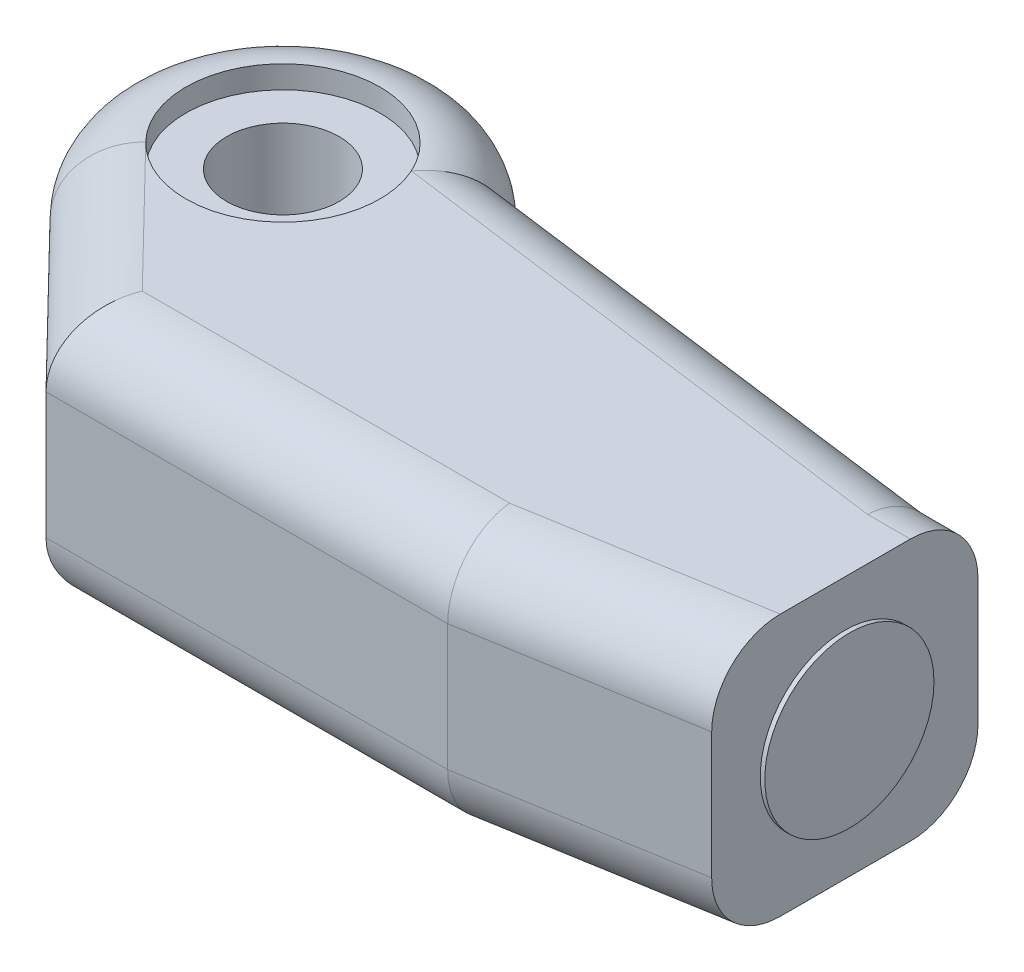
ISO-10303-21;
HEADER;
FILE_DESCRIPTION(('STEP AP214'),'2;1');
FILE_NAME('part.step','',(''),(''),'','','');
FILE_SCHEMA(('AUTOMOTIVE_DESIGN { 1 0 10303 214 1 1 1 1 }'));
ENDSEC;
DATA;
#1=APPLICATION_CONTEXT('core data for automotive mechanical design processes');
#2=APPLICATION_PROTOCOL_DEFINITION('international standard','automotive_design',2000,#1);
#3=PRODUCT_CONTEXT('',#1,'mechanical');
#4=PRODUCT('Part','Part','',(#3));
#5=PRODUCT_RELATED_PRODUCT_CATEGORY('part','',(#4));
#6=PRODUCT_DEFINITION_FORMATION('','',#4);
#7=PRODUCT_DEFINITION_CONTEXT('part definition',#1,'design');
#8=PRODUCT_DEFINITION('design','',#6,#7);
#9=PRODUCT_DEFINITION_SHAPE('','',#8);
#10=(LENGTH_UNIT() NAMED_UNIT(*) SI_UNIT(.MILLI.,.METRE.));
#11=(NAMED_UNIT(*) PLANE_ANGLE_UNIT() SI_UNIT($,.RADIAN.));
#12=(NAMED_UNIT(*) SI_UNIT($,.STERADIAN.) SOLID_ANGLE_UNIT());
#13=UNCERTAINTY_MEASURE_WITH_UNIT(LENGTH_MEASURE(1.E-05),#10,'distance_accuracy_value','');
#14=(GEOMETRIC_REPRESENTATION_CONTEXT(3) GLOBAL_UNCERTAINTY_ASSIGNED_CONTEXT((#13)) GLOBAL_UNIT_ASSIGNED_CONTEXT((#10,
#11,#12)) REPRESENTATION_CONTEXT('',''));
#15=CARTESIAN_POINT('',(0.,0.,0.));
#16=DIRECTION('',(0.,0.,1.));
#17=DIRECTION('',(1.,0.,0.));
#18=AXIS2_PLACEMENT_3D('',#15,#16,#17);
#19=CARTESIAN_POINT('',(0.,58.,0.));
#20=DIRECTION('',(0.,-1.,0.));
#21=DIRECTION('',(0.,0.,-1.));
#22=AXIS2_PLACEMENT_3D('',#19,#20,#21);
#23=CYLINDRICAL_SURFACE('',#22,73.);
#24=DIRECTION('',(0.,-1.,0.));
#25=VECTOR('',#24,1.);
#26=CARTESIAN_POINT('',(-52.3049225386602,58.,50.9234236695134));
#27=LINE('',#26,#25);
#28=CARTESIAN_POINT('',(-52.3049225386602,28.,50.9234236695134));
#29=VERTEX_POINT('',#28);
#30=CARTESIAN_POINT('',(-52.3049225386602,-28.,50.9234236695134));
#31=VERTEX_POINT('',#30);
#32=EDGE_CURVE('E310',#29,#31,#27,.T.);
#33=ORIENTED_EDGE('',*,*,#32,.F.);
#34=CARTESIAN_POINT('',(0.,28.,0.));
#35=DIRECTION('',(0.,1.,0.));
#36=DIRECTION('',(0.,0.,1.));
#37=AXIS2_PLACEMENT_3D('',#34,#35,#36);
#38=CIRCLE('',#37,73.);
#39=CARTESIAN_POINT('',(57.,28.,-45.6070170039656));
#40=VERTEX_POINT('',#39);
#41=EDGE_CURVE('E341',#29,#40,#38,.F.);
#42=ORIENTED_EDGE('',*,*,#41,.T.);
#43=DIRECTION('',(0.,-1.,0.));
#44=VECTOR('',#43,1.);
#45=CARTESIAN_POINT('',(57.,58.,-45.6070170039656));
#46=LINE('',#45,#44);
#47=CARTESIAN_POINT('',(57.,-28.,-45.6070170039656));
#48=VERTEX_POINT('',#47);
#49=EDGE_CURVE('E301',#40,#48,#46,.T.);
#50=ORIENTED_EDGE('',*,*,#49,.T.);
#51=CARTESIAN_POINT('',(0.,-28.,0.));
#52=DIRECTION('',(0.,1.,0.));
#53=DIRECTION('',(0.,0.,1.));
#54=AXIS2_PLACEMENT_3D('',#51,#52,#53);
#55=CIRCLE('',#54,73.);
#56=EDGE_CURVE('E161',#48,#31,#55,.T.);
#57=ORIENTED_EDGE('',*,*,#56,.T.);
#58=EDGE_LOOP('',(#33,#42,#50,#57));
#59=FACE_BOUND('',#58,.T.);
#60=ADVANCED_FACE('F38',(#59),#23,.T.);
#61=CARTESIAN_POINT('',(-52.3049225386602,58.,50.9234236695134));
#62=DIRECTION('',(0.716505788200824,0.,-0.697581146157718));
#63=DIRECTION('',(-0.697581146157718,0.,-0.716505788200824));
#64=AXIS2_PLACEMENT_3D('',#61,#62,#63);
#65=PLANE('',#64);
#66=DIRECTION('',(0.,-1.,0.));
#67=VECTOR('',#66,1.);
#68=CARTESIAN_POINT('',(13.,58.,118.));
#69=LINE('',#68,#67);
#70=CARTESIAN_POINT('',(13.,28.,118.));
#71=VERTEX_POINT('',#70);
#72=CARTESIAN_POINT('',(13.,-28.,118.));
#73=VERTEX_POINT('',#72);
#74=EDGE_CURVE('E307',#71,#73,#69,.T.);
#75=ORIENTED_EDGE('',*,*,#74,.F.);
#76=DIRECTION('',(0.697581146157718,0.,0.716505788200824));
#77=VECTOR('',#76,1.);
#78=CARTESIAN_POINT('',(-52.3049225386602,28.,50.9234236695134));
#79=LINE('',#78,#77);
#80=EDGE_CURVE('E334',#71,#29,#79,.F.);
#81=ORIENTED_EDGE('',*,*,#80,.T.);
#82=ORIENTED_EDGE('',*,*,#32,.T.);
#83=DIRECTION('',(0.697581146157718,0.,0.716505788200824));
#84=VECTOR('',#83,1.);
#85=CARTESIAN_POINT('',(-52.3049225386602,-28.,50.9234236695134));
#86=LINE('',#85,#84);
#87=EDGE_CURVE('E332',#31,#73,#86,.T.);
#88=ORIENTED_EDGE('',*,*,#87,.T.);
#89=EDGE_LOOP('',(#75,#81,#82,#88));
#90=FACE_BOUND('',#89,.T.);
#91=ADVANCED_FACE('F214',(#90),#65,.F.);
#92=CARTESIAN_POINT('',(191.,58.,118.));
#93=DIRECTION('',(0.,0.,-1.));
#94=DIRECTION('',(-1.,0.,0.));
#95=AXIS2_PLACEMENT_3D('',#92,#93,#94);
#96=PLANE('',#95);
#97=DIRECTION('',(0.,-1.,0.));
#98=VECTOR('',#97,1.);
#99=CARTESIAN_POINT('',(191.,58.,118.));
#100=LINE('',#99,#98);
#101=CARTESIAN_POINT('',(191.,28.,118.));
#102=VERTEX_POINT('',#101);
#103=CARTESIAN_POINT('',(191.,-28.,118.));
#104=VERTEX_POINT('',#103);
#105=EDGE_CURVE('E298',#102,#104,#100,.T.);
#106=ORIENTED_EDGE('',*,*,#105,.F.);
#107=DIRECTION('',(1.,0.,0.));
#108=VECTOR('',#107,1.);
#109=CARTESIAN_POINT('',(13.,28.,118.));
#110=LINE('',#109,#108);
#111=EDGE_CURVE('E330',#102,#71,#110,.F.);
#112=ORIENTED_EDGE('',*,*,#111,.T.);
#113=ORIENTED_EDGE('',*,*,#74,.T.);
#114=DIRECTION('',(1.,0.,0.));
#115=VECTOR('',#114,1.);
#116=CARTESIAN_POINT('',(191.,-28.,118.));
#117=LINE('',#116,#115);
#118=EDGE_CURVE('E328',#73,#104,#117,.T.);
#119=ORIENTED_EDGE('',*,*,#118,.T.);
#120=EDGE_LOOP('',(#106,#112,#113,#119));
#121=FACE_BOUND('',#120,.T.);
#122=ADVANCED_FACE('F220',(#121),#96,.F.);
#123=CARTESIAN_POINT('',(291.,58.,101.));
#124=DIRECTION('',(-0.167595493933869,0.,-0.985855846669818));
#125=DIRECTION('',(-0.985855846669818,0.,0.167595493933869));
#126=AXIS2_PLACEMENT_3D('',#123,#124,#125);
#127=PLANE('',#126);
#128=DIRECTION('',(0.,-1.,0.));
#129=VECTOR('',#128,1.);
#130=CARTESIAN_POINT('',(291.,58.,101.));
#131=LINE('',#130,#129);
#132=CARTESIAN_POINT('',(291.,28.,101.));
#133=VERTEX_POINT('',#132);
#134=CARTESIAN_POINT('',(291.,-28.,101.));
#135=VERTEX_POINT('',#134);
#136=EDGE_CURVE('E294',#133,#135,#131,.T.);
#137=ORIENTED_EDGE('',*,*,#136,.F.);
#138=DIRECTION('',(0.985855846669818,0.,-0.167595493933869));
#139=VECTOR('',#138,1.);
#140=CARTESIAN_POINT('',(191.,28.,118.));
#141=LINE('',#140,#139);
#142=EDGE_CURVE('E326',#133,#102,#141,.F.);
#143=ORIENTED_EDGE('',*,*,#142,.T.);
#144=ORIENTED_EDGE('',*,*,#105,.T.);
#145=DIRECTION('',(0.985855846669818,0.,-0.167595493933869));
#146=VECTOR('',#145,1.);
#147=CARTESIAN_POINT('',(291.,-28.,101.));
#148=LINE('',#147,#146);
#149=EDGE_CURVE('E324',#104,#135,#148,.T.);
#150=ORIENTED_EDGE('',*,*,#149,.T.);
#151=EDGE_LOOP('',(#137,#143,#144,#150));
#152=FACE_BOUND('',#151,.T.);
#153=ADVANCED_FACE('F382',(#152),#127,.F.);
#154=CARTESIAN_POINT('',(291.,58.,0.));
#155=DIRECTION('',(-1.,0.,0.));
#156=DIRECTION('',(0.,0.,1.));
#157=AXIS2_PLACEMENT_3D('',#154,#155,#156);
#158=PLANE('',#157);
#159=CARTESIAN_POINT('',(291.,0.,42.));
#160=DIRECTION('',(1.,0.,0.));
#161=DIRECTION('',(0.,0.,-1.));
#162=AXIS2_PLACEMENT_3D('',#159,#160,#161);
#163=CIRCLE('',#162,37.5);
#164=CARTESIAN_POINT('',(291.,0.,4.50000000000001));
#165=VERTEX_POINT('',#164);
#166=EDGE_CURVE('E313',#165,#165,#163,.T.);
#167=ORIENTED_EDGE('',*,*,#166,.F.);
#168=EDGE_LOOP('',(#167));
#169=FACE_BOUND('',#168,.T.);
#170=DIRECTION('',(0.,-1.,0.));
#171=VECTOR('',#170,1.);
#172=CARTESIAN_POINT('',(291.,58.,-17.));
#173=LINE('',#172,#171);
#174=CARTESIAN_POINT('',(291.,28.,-17.));
#175=VERTEX_POINT('',#174);
#176=CARTESIAN_POINT('',(291.,-28.,-17.));
#177=VERTEX_POINT('',#176);
#178=EDGE_CURVE('E290',#175,#177,#173,.T.);
#179=ORIENTED_EDGE('',*,*,#178,.F.);
#180=CARTESIAN_POINT('',(291.,28.,13.));
#181=DIRECTION('',(-1.,0.,0.));
#182=DIRECTION('',(0.,0.,1.));
#183=AXIS2_PLACEMENT_3D('',#180,#181,#182);
#184=CIRCLE('',#183,30.);
#185=CARTESIAN_POINT('',(291.,58.,13.));
#186=VERTEX_POINT('',#185);
#187=EDGE_CURVE('E284',#175,#186,#184,.F.);
#188=ORIENTED_EDGE('',*,*,#187,.T.);
#189=DIRECTION('',(0.,0.,-1.));
#190=VECTOR('',#189,1.);
#191=CARTESIAN_POINT('',(291.,58.,0.));
#192=LINE('',#191,#190);
#193=CARTESIAN_POINT('',(291.,58.,70.5695875808427));
#194=VERTEX_POINT('',#193);
#195=EDGE_CURVE('E273',#194,#186,#192,.T.);
#196=ORIENTED_EDGE('',*,*,#195,.F.);
#197=CARTESIAN_POINT('',(291.,28.,70.5695875808428));
#198=DIRECTION('',(-1.,0.,0.));
#199=DIRECTION('',(0.,0.,1.));
#200=AXIS2_PLACEMENT_3D('',#197,#198,#199);
#201=ELLIPSE('',#200,30.4304124191572,30.);
#202=EDGE_CURVE('E322',#194,#133,#201,.F.);
#203=ORIENTED_EDGE('',*,*,#202,.T.);
#204=ORIENTED_EDGE('',*,*,#136,.T.);
#205=CARTESIAN_POINT('',(291.,-28.,70.5695875808428));
#206=DIRECTION('',(-1.,0.,0.));
#207=DIRECTION('',(0.,0.,-1.));
#208=AXIS2_PLACEMENT_3D('',#205,#206,#207);
#209=ELLIPSE('',#208,30.4304124191572,30.);
#210=CARTESIAN_POINT('',(291.,-58.,70.5695875808428));
#211=VERTEX_POINT('',#210);
#212=EDGE_CURVE('E320',#135,#211,#209,.F.);
#213=ORIENTED_EDGE('',*,*,#212,.T.);
#214=DIRECTION('',(0.,0.,-1.));
#215=VECTOR('',#214,1.);
#216=CARTESIAN_POINT('',(291.,-58.,0.));
#217=LINE('',#216,#215);
#218=CARTESIAN_POINT('',(291.,-58.,13.));
#219=VERTEX_POINT('',#218);
#220=EDGE_CURVE('E361',#211,#219,#217,.T.);
#221=ORIENTED_EDGE('',*,*,#220,.T.);
#222=CARTESIAN_POINT('',(291.,-28.,13.));
#223=DIRECTION('',(-1.,0.,0.));
#224=DIRECTION('',(0.,0.,1.));
#225=AXIS2_PLACEMENT_3D('',#222,#223,#224);
#226=CIRCLE('',#225,30.);
#227=EDGE_CURVE('E282',#219,#177,#226,.F.);
#228=ORIENTED_EDGE('',*,*,#227,.T.);
#229=EDGE_LOOP('',(#179,#188,#196,#203,#204,#213,#221,#228));
#230=FACE_BOUND('',#229,.T.);
#231=ADVANCED_FACE('F288',(#169,#230),#158,.F.);
#232=CARTESIAN_POINT('',(291.,58.,-17.));
#233=DIRECTION('',(0.,0.,1.));
#234=DIRECTION('',(1.,0.,0.));
#235=AXIS2_PLACEMENT_3D('',#232,#233,#234);
#236=PLANE('',#235);
#237=DIRECTION('',(0.,-1.,0.));
#238=VECTOR('',#237,1.);
#239=CARTESIAN_POINT('',(274.,58.,-17.));
#240=LINE('',#239,#238);
#241=CARTESIAN_POINT('',(274.,28.,-17.));
#242=VERTEX_POINT('',#241);
#243=CARTESIAN_POINT('',(274.,-28.,-17.));
#244=VERTEX_POINT('',#243);
#245=EDGE_CURVE('E295',#242,#244,#240,.T.);
#246=ORIENTED_EDGE('',*,*,#245,.F.);
#247=DIRECTION('',(-1.,0.,0.));
#248=VECTOR('',#247,1.);
#249=CARTESIAN_POINT('',(291.,28.,-17.));
#250=LINE('',#249,#248);
#251=EDGE_CURVE('E267',#242,#175,#250,.F.);
#252=ORIENTED_EDGE('',*,*,#251,.T.);
#253=ORIENTED_EDGE('',*,*,#178,.T.);
#254=DIRECTION('',(-1.,0.,0.));
#255=VECTOR('',#254,1.);
#256=CARTESIAN_POINT('',(291.,-28.,-17.));
#257=LINE('',#256,#255);
#258=EDGE_CURVE('E274',#177,#244,#257,.T.);
#259=ORIENTED_EDGE('',*,*,#258,.T.);
#260=EDGE_LOOP('',(#246,#252,#253,#259));
#261=FACE_BOUND('',#260,.T.);
#262=ADVANCED_FACE('F374',(#261),#236,.F.);
#263=CARTESIAN_POINT('',(274.,58.,-17.));
#264=DIRECTION('',(-0.130698754240664,0.,0.991422127874872));
#265=DIRECTION('',(0.991422127874872,0.,0.130698754240664));
#266=AXIS2_PLACEMENT_3D('',#263,#264,#265);
#267=PLANE('',#266);
#268=ORIENTED_EDGE('',*,*,#49,.F.);
#269=DIRECTION('',(-0.991422127874872,0.,-0.130698754240664));
#270=VECTOR('',#269,1.);
#271=CARTESIAN_POINT('',(274.,28.,-17.));
#272=LINE('',#271,#270);
#273=EDGE_CURVE('E338',#40,#242,#272,.F.);
#274=ORIENTED_EDGE('',*,*,#273,.T.);
#275=ORIENTED_EDGE('',*,*,#245,.T.);
#276=DIRECTION('',(-0.991422127874872,0.,-0.130698754240664));
#277=VECTOR('',#276,1.);
#278=CARTESIAN_POINT('',(274.,-28.,-17.));
#279=LINE('',#278,#277);
#280=EDGE_CURVE('E336',#244,#48,#279,.T.);
#281=ORIENTED_EDGE('',*,*,#280,.T.);
#282=EDGE_LOOP('',(#268,#274,#275,#281));
#283=FACE_BOUND('',#282,.T.);
#284=ADVANCED_FACE('F372',(#283),#267,.F.);
#285=CARTESIAN_POINT('',(0.,58.,0.));
#286=DIRECTION('',(0.,1.,0.));
#287=DIRECTION('',(0.,0.,1.));
#288=AXIS2_PLACEMENT_3D('',#285,#286,#287);
#289=PLANE('',#288);
#290=CARTESIAN_POINT('',(0.,58.,0.));
#291=DIRECTION('',(0.,1.,0.));
#292=DIRECTION('',(0.,0.,1.));
#293=AXIS2_PLACEMENT_3D('',#290,#291,#292);
#294=CIRCLE('',#293,43.);
#295=CARTESIAN_POINT('',(-30.8097488926355,58.,29.9959892847819));
#296=VERTEX_POINT('',#295);
#297=CARTESIAN_POINT('',(39.1902560850288,58.,-17.6953052528026));
#298=VERTEX_POINT('',#297);
#299=EDGE_CURVE('E169',#296,#298,#294,.T.);
#300=ORIENTED_EDGE('',*,*,#299,.F.);
#301=DIRECTION('',(0.697581146157718,0.,0.716505788200824));
#302=VECTOR('',#301,1.);
#303=CARTESIAN_POINT('',(34.4951736460247,58.,97.0725656152685));
#304=LINE('',#303,#302);
#305=CARTESIAN_POINT('',(25.6622363205886,58.,88.));
#306=VERTEX_POINT('',#305);
#307=EDGE_CURVE('E262',#296,#306,#304,.T.);
#308=ORIENTED_EDGE('',*,*,#307,.T.);
#309=DIRECTION('',(1.,0.,0.));
#310=VECTOR('',#309,1.);
#311=CARTESIAN_POINT('',(191.,58.,88.));
#312=LINE('',#311,#310);
#313=CARTESIAN_POINT('',(188.468162240251,58.,88.));
#314=VERTEX_POINT('',#313);
#315=EDGE_CURVE('E316',#306,#314,#312,.T.);
#316=ORIENTED_EDGE('',*,*,#315,.T.);
#317=DIRECTION('',(0.985855846669818,0.,-0.167595493933869));
#318=VECTOR('',#317,1.);
#319=CARTESIAN_POINT('',(285.972135181984,58.,71.4243245999055));
#320=LINE('',#319,#318);
#321=EDGE_CURVE('E318',#314,#194,#320,.T.);
#322=ORIENTED_EDGE('',*,*,#321,.T.);
#323=ORIENTED_EDGE('',*,*,#195,.T.);
#324=DIRECTION('',(-1.,0.,0.));
#325=VECTOR('',#324,1.);
#326=CARTESIAN_POINT('',(44.464529870278,58.,13.0000000000001));
#327=LINE('',#326,#325);
#328=CARTESIAN_POINT('',(272.031074089046,58.,13.));
#329=VERTEX_POINT('',#328);
#330=EDGE_CURVE('E158',#186,#329,#327,.T.);
#331=ORIENTED_EDGE('',*,*,#330,.T.);
#332=DIRECTION('',(-0.991422127874872,0.,-0.130698754240664));
#333=VECTOR('',#332,1.);
#334=CARTESIAN_POINT('',(53.07903737278,58.,-15.8643531677194));
#335=LINE('',#334,#333);
#336=EDGE_CURVE('E253',#329,#298,#335,.T.);
#337=ORIENTED_EDGE('',*,*,#336,.T.);
#338=EDGE_LOOP('',(#300,#308,#316,#322,#323,#331,#337));
#339=FACE_BOUND('',#338,.T.);
#340=ADVANCED_FACE('F270',(#339),#289,.T.);
#341=CARTESIAN_POINT('',(0.,-58.,0.));
#342=DIRECTION('',(0.,1.,0.));
#343=DIRECTION('',(0.,0.,1.));
#344=AXIS2_PLACEMENT_3D('',#341,#342,#343);
#345=PLANE('',#344);
#346=CARTESIAN_POINT('',(0.,-58.,0.));
#347=DIRECTION('',(0.,1.,0.));
#348=DIRECTION('',(0.,0.,1.));
#349=AXIS2_PLACEMENT_3D('',#346,#347,#348);
#350=CIRCLE('',#349,43.);
#351=CARTESIAN_POINT('',(-30.8097488926355,-58.,29.9959892847819));
#352=VERTEX_POINT('',#351);
#353=CARTESIAN_POINT('',(39.1902560850288,-58.,-17.6953052528026));
#354=VERTEX_POINT('',#353);
#355=EDGE_CURVE('E141',#352,#354,#350,.T.);
#356=ORIENTED_EDGE('',*,*,#355,.T.);
#357=DIRECTION('',(-0.991422127874872,0.,-0.130698754240664));
#358=VECTOR('',#357,1.);
#359=CARTESIAN_POINT('',(2.96237023711481,-58.,-22.4712119185584));
#360=LINE('',#359,#358);
#361=CARTESIAN_POINT('',(272.031074089046,-58.,13.));
#362=VERTEX_POINT('',#361);
#363=EDGE_CURVE('E54',#354,#362,#360,.F.);
#364=ORIENTED_EDGE('',*,*,#363,.T.);
#365=DIRECTION('',(-1.,0.,0.));
#366=VECTOR('',#365,1.);
#367=CARTESIAN_POINT('',(0.,-58.,13.0000000000001));
#368=LINE('',#367,#366);
#369=EDGE_CURVE('E58',#362,#219,#368,.F.);
#370=ORIENTED_EDGE('',*,*,#369,.T.);
#371=ORIENTED_EDGE('',*,*,#220,.F.);
#372=DIRECTION('',(0.985855846669818,0.,-0.167595493933869));
#373=VECTOR('',#372,1.);
#374=CARTESIAN_POINT('',(19.833540566375,-58.,116.667885684559));
#375=LINE('',#374,#373);
#376=CARTESIAN_POINT('',(188.468162240251,-58.,88.));
#377=VERTEX_POINT('',#376);
#378=EDGE_CURVE('E343',#211,#377,#375,.F.);
#379=ORIENTED_EDGE('',*,*,#378,.T.);
#380=DIRECTION('',(1.,0.,0.));
#381=VECTOR('',#380,1.);
#382=CARTESIAN_POINT('',(0.,-58.,88.));
#383=LINE('',#382,#381);
#384=CARTESIAN_POINT('',(25.6622363205886,-58.,88.));
#385=VERTEX_POINT('',#384);
#386=EDGE_CURVE('E345',#377,#385,#383,.F.);
#387=ORIENTED_EDGE('',*,*,#386,.T.);
#388=DIRECTION('',(0.697581146157718,0.,0.716505788200824));
#389=VECTOR('',#388,1.);
#390=CARTESIAN_POINT('',(-30.8097488926355,-58.,29.9959892847819));
#391=LINE('',#390,#389);
#392=EDGE_CURVE('E146',#385,#352,#391,.F.);
#393=ORIENTED_EDGE('',*,*,#392,.T.);
#394=EDGE_LOOP('',(#356,#364,#370,#371,#379,#387,#393));
#395=FACE_BOUND('',#394,.T.);
#396=ADVANCED_FACE('F148',(#395),#345,.F.);
#397=CARTESIAN_POINT('',(293.,0.,42.));
#398=DIRECTION('',(-1.,0.,0.));
#399=DIRECTION('',(0.,0.,1.));
#400=AXIS2_PLACEMENT_3D('',#397,#398,#399);
#401=CYLINDRICAL_SURFACE('',#400,37.5);
#402=CARTESIAN_POINT('',(293.,0.,42.));
#403=DIRECTION('',(1.,0.,0.));
#404=DIRECTION('',(0.,0.,-1.));
#405=AXIS2_PLACEMENT_3D('',#402,#403,#404);
#406=CIRCLE('',#405,37.5);
#407=CARTESIAN_POINT('',(293.,0.,4.50000000000001));
#408=VERTEX_POINT('',#407);
#409=EDGE_CURVE('E358',#408,#408,#406,.T.);
#410=ORIENTED_EDGE('',*,*,#409,.F.);
#411=EDGE_LOOP('',(#410));
#412=FACE_BOUND('',#411,.T.);
#413=ORIENTED_EDGE('',*,*,#166,.T.);
#414=EDGE_LOOP('',(#413));
#415=FACE_BOUND('',#414,.T.);
#416=ADVANCED_FACE('F248',(#412,#415),#401,.T.);
#417=CARTESIAN_POINT('',(293.,0.,42.));
#418=DIRECTION('',(1.,0.,0.));
#419=DIRECTION('',(0.,0.,-1.));
#420=AXIS2_PLACEMENT_3D('',#417,#418,#419);
#421=PLANE('',#420);
#422=ORIENTED_EDGE('',*,*,#409,.T.);
#423=EDGE_LOOP('',(#422));
#424=FACE_BOUND('',#423,.T.);
#425=ADVANCED_FACE('F243',(#424),#421,.T.);
#426=CARTESIAN_POINT('',(2.96237023711481,28.,-22.4712119185584));
#427=DIRECTION('',(0.991422127874872,0.,0.130698754240664));
#428=DIRECTION('',(0.130698754240664,0.,-0.991422127874872));
#429=AXIS2_PLACEMENT_3D('',#426,#427,#428);
#430=CYLINDRICAL_SURFACE('',#429,30.);
#431=ORIENTED_EDGE('',*,*,#336,.F.);
#432=CARTESIAN_POINT('',(272.031074089046,28.,13.));
#433=DIRECTION('',(0.997853227652963,0.,0.0654899691751656));
#434=DIRECTION('',(0.0654899691751653,0.,-0.997853227652963));
#435=AXIS2_PLACEMENT_3D('',#432,#433,#434);
#436=ELLIPSE('',#435,30.0645417268054,30.);
#437=EDGE_CURVE('E47',#329,#242,#436,.F.);
#438=ORIENTED_EDGE('',*,*,#437,.T.);
#439=ORIENTED_EDGE('',*,*,#273,.F.);
#440=CARTESIAN_POINT('',(57.,28.,-45.6070170039656));
#441=CARTESIAN_POINT('',(57.0000001480446,28.3984742739384,-45.6070191010326));
#442=CARTESIAN_POINT('',(56.9957956773733,28.7969023921218,-45.5995622875308));
#443=CARTESIAN_POINT('',(56.9789892671505,29.5930127660879,-45.569767481325));
#444=CARTESIAN_POINT('',(56.966387574372,29.9906950434445,-45.5474299259282));
#445=CARTESIAN_POINT('',(56.9160167687516,31.1813748309405,-45.4581731738608));
#446=CARTESIAN_POINT('',(56.8656819085083,31.9723105642552,-45.369009832961));
#447=CARTESIAN_POINT('',(56.7319944355904,33.5406728601018,-45.1325555724352));
#448=CARTESIAN_POINT('',(56.6487203280282,34.3181269880483,-44.9854028637267));
#449=CARTESIAN_POINT('',(56.4995187381609,35.4712633745418,-44.7223155422949));
#450=CARTESIAN_POINT('',(56.4457327611725,35.8534891699585,-44.6275535365141));
#451=CARTESIAN_POINT('',(56.3301361676116,36.6130960091843,-44.4241251468631));
#452=CARTESIAN_POINT('',(56.2683236261393,36.9904758669264,-44.3154554277889));
#453=CARTESIAN_POINT('',(56.0710515713751,38.1139813328338,-43.9690870895367));
#454=CARTESIAN_POINT('',(55.9237085301608,38.8518521434636,-43.710942534151));
#455=CARTESIAN_POINT('',(55.5983136028556,40.3003345350253,-43.1427531691521));
#456=CARTESIAN_POINT('',(55.420260697949,41.0109452106316,-42.8327066376738));
#457=CARTESIAN_POINT('',(55.1310164101507,42.0530176884844,-42.3310263223528));
#458=CARTESIAN_POINT('',(55.0308787106892,42.3964870450375,-42.1576481935434));
#459=CARTESIAN_POINT('',(54.8233885516706,43.0748863849249,-41.7991386195252));
#460=CARTESIAN_POINT('',(54.7160379602339,43.4098185486088,-41.6140102182891));
#461=CARTESIAN_POINT('',(54.3833389075593,44.4012580006146,-41.0415277536558));
#462=CARTESIAN_POINT('',(54.1473306694934,45.0444532655505,-40.6370547120494));
#463=CARTESIAN_POINT('',(53.642131843673,46.3069692956855,-39.7756954329945));
#464=CARTESIAN_POINT('',(53.3722600619334,46.9252934520328,-39.3177529554818));
#465=CARTESIAN_POINT('',(52.8057213835497,48.1173141419166,-38.3620886625263));
#466=CARTESIAN_POINT('',(52.5090541370201,48.691010092532,-37.8643663276622));
#467=CARTESIAN_POINT('',(51.8904972086528,49.7910773673279,-36.833413151616));
#468=CARTESIAN_POINT('',(51.5686036407202,50.3174413731338,-36.3001768414413));
#469=CARTESIAN_POINT('',(50.90127809141,51.3205352672237,-35.2026811138821));
#470=CARTESIAN_POINT('',(50.5558454188045,51.7972636969143,-34.6384207855685));
#471=CARTESIAN_POINT('',(49.8195987656101,52.72909718572,-33.4452346397706));
#472=CARTESIAN_POINT('',(49.4272943042463,53.1807075349887,-32.8144977717385));
#473=CARTESIAN_POINT('',(48.6198287581938,54.0240770583233,-31.5281694853602));
#474=CARTESIAN_POINT('',(48.2046663677328,54.4158328083251,-30.8725766477699));
#475=CARTESIAN_POINT('',(47.3531802717253,55.1387755461479,-29.5413473482713));
#476=CARTESIAN_POINT('',(46.9168452130184,55.4699295738664,-28.8657002099992));
#477=CARTESIAN_POINT('',(46.2482351574846,55.920624550573,-27.8415149008865));
#478=CARTESIAN_POINT('',(46.0230090691572,56.0631860152719,-27.4983267904406));
#479=CARTESIAN_POINT('',(45.5680068665408,56.3330200099094,-26.8088680001761));
#480=CARTESIAN_POINT('',(45.3382299465571,56.4602898038581,-26.4625967805958));
#481=CARTESIAN_POINT('',(44.6440182716573,56.8183334223107,-25.4224684224937));
#482=CARTESIAN_POINT('',(44.1731676840879,57.0263735803555,-24.7249419609988));
#483=CARTESIAN_POINT('',(43.2162531124175,57.3819991994729,-23.324950993035));
#484=CARTESIAN_POINT('',(42.7301886011176,57.5295825630706,-22.6224863161007));
#485=CARTESIAN_POINT('',(41.9914653880939,57.7060902233963,-21.5690866586164));
#486=CARTESIAN_POINT('',(41.743810799692,57.7574263072654,-21.2182681552616));
#487=CARTESIAN_POINT('',(41.2454001000096,57.8453504769308,-20.5170928716901));
#488=CARTESIAN_POINT('',(40.9946444994883,57.8819409589495,-20.1667360256831));
#489=CARTESIAN_POINT('',(40.2381215051324,57.9697782743769,-19.1172543811248));
#490=CARTESIAN_POINT('',(39.7278286102008,57.999154944573,-18.4193339551489));
#491=CARTESIAN_POINT('',(39.2051932655647,57.9999940157087,-17.7154168564348));
#492=CARTESIAN_POINT('',(39.1977251856594,58.0000000058663,-17.7053606243611));
#493=CARTESIAN_POINT('',(39.1902560850288,58.,-17.6953052528026));
#494=B_SPLINE_CURVE_WITH_KNOTS('',3,(#440,#441,#442,#443,#444,#445,#446,#447,#448,#449,#450,
#451,#452,#453,#454,#455,#456,#457,#458,#459,#460,#461,#462,#463,#464,#465,#466,#467,#468,#469,
#470,#471,#472,#473,#474,#475,#476,#477,#478,#479,#480,#481,#482,#483,#484,#485,#486,#487,#488,
#489,#490,#491,#492,#493),.UNSPECIFIED.,.F.,.F.,(4,2,2,2,2,2,2,2,2,2,2,2,2,2,2,2,2,2,2,2,2,2,2,
2,2,2,4),(0.,1.19523896096054,2.39044279843078,4.77993774998458,7.16377173152296,
8.35582284144794,9.54816035427941,11.9316626229143,14.3152439806979,15.5076519034222,
16.6997521772089,19.0837986291291,21.5273504401137,23.9709341627266,26.414895060245,
28.8589277558533,31.4640045162669,34.0692302479055,36.6758687273239,37.9792421189653,
39.2828483643513,41.8811008066954,44.479443384617,45.7766544026039,47.0736545332436,
49.6662362029821,49.7038141207352),.UNSPECIFIED.);
#495=EDGE_CURVE('E178',#298,#40,#494,.F.);
#496=ORIENTED_EDGE('',*,*,#495,.F.);
#497=EDGE_LOOP('',(#431,#438,#439,#496));
#498=FACE_BOUND('',#497,.T.);
#499=ADVANCED_FACE('F239',(#498),#430,.T.);
#500=CARTESIAN_POINT('',(0.,28.,0.));
#501=DIRECTION('',(0.,1.,0.));
#502=DIRECTION('',(0.,0.,1.));
#503=AXIS2_PLACEMENT_3D('',#500,#501,#502);
#504=TOROIDAL_SURFACE('',#503,43.,30.);
#505=ORIENTED_EDGE('',*,*,#495,.T.);
#506=ORIENTED_EDGE('',*,*,#41,.F.);
#507=CARTESIAN_POINT('',(-30.8097488926355,28.,29.9959892847819));
#508=DIRECTION('',(0.697581146157718,0.,0.716505788200824));
#509=DIRECTION('',(0.716505788200825,0.,-0.697581146157718));
#510=AXIS2_PLACEMENT_3D('',#507,#508,#509);
#511=CIRCLE('',#510,30.);
#512=EDGE_CURVE('E353',#296,#29,#511,.T.);
#513=ORIENTED_EDGE('',*,*,#512,.F.);
#514=CARTESIAN_POINT('',(0.,58.,0.));
#515=DIRECTION('',(0.,1.,0.));
#516=DIRECTION('',(0.,0.,1.));
#517=AXIS2_PLACEMENT_3D('',#514,#515,#516);
#518=CIRCLE('',#517,43.);
#519=EDGE_CURVE('E263',#298,#296,#518,.T.);
#520=ORIENTED_EDGE('',*,*,#519,.F.);
#521=EDGE_LOOP('',(#505,#506,#513,#520));
#522=FACE_BOUND('',#521,.T.);
#523=ADVANCED_FACE('F235',(#522),#504,.T.);
#524=CARTESIAN_POINT('',(-30.8097488926355,28.,29.9959892847819));
#525=DIRECTION('',(-0.697581146157718,0.,-0.716505788200824));
#526=DIRECTION('',(-0.716505788200824,0.,0.697581146157718));
#527=AXIS2_PLACEMENT_3D('',#524,#525,#526);
#528=CYLINDRICAL_SURFACE('',#527,30.);
#529=ORIENTED_EDGE('',*,*,#512,.T.);
#530=ORIENTED_EDGE('',*,*,#80,.F.);
#531=CARTESIAN_POINT('',(25.6622363205886,28.,88.));
#532=DIRECTION('',(-0.921298308409854,0.,-0.388856563428137));
#533=DIRECTION('',(0.388856563428137,0.,-0.921298308409854));
#534=AXIS2_PLACEMENT_3D('',#531,#532,#533);
#535=ELLIPSE('',#534,32.5627429532347,30.);
#536=EDGE_CURVE('E351',#306,#71,#535,.F.);
#537=ORIENTED_EDGE('',*,*,#536,.F.);
#538=ORIENTED_EDGE('',*,*,#307,.F.);
#539=EDGE_LOOP('',(#529,#530,#537,#538));
#540=FACE_BOUND('',#539,.T.);
#541=ADVANCED_FACE('F232',(#540),#528,.T.);
#542=CARTESIAN_POINT('',(0.,28.,88.));
#543=DIRECTION('',(-1.,0.,0.));
#544=DIRECTION('',(0.,0.,1.));
#545=AXIS2_PLACEMENT_3D('',#542,#543,#544);
#546=CYLINDRICAL_SURFACE('',#545,30.);
#547=ORIENTED_EDGE('',*,*,#536,.T.);
#548=ORIENTED_EDGE('',*,*,#111,.F.);
#549=CARTESIAN_POINT('',(188.468162240251,28.,88.));
#550=DIRECTION('',(-0.996457687679165,0.,0.0840956399885946));
#551=DIRECTION('',(-0.0840956399885939,0.,-0.996457687679165));
#552=AXIS2_PLACEMENT_3D('',#549,#550,#551);
#553=ELLIPSE('',#552,30.1066471471283,30.);
#554=EDGE_CURVE('E348',#314,#102,#553,.F.);
#555=ORIENTED_EDGE('',*,*,#554,.F.);
#556=ORIENTED_EDGE('',*,*,#315,.F.);
#557=EDGE_LOOP('',(#547,#548,#555,#556));
#558=FACE_BOUND('',#557,.T.);
#559=ADVANCED_FACE('F228',(#558),#546,.T.);
#560=CARTESIAN_POINT('',(19.833540566375,28.,116.667885684559));
#561=DIRECTION('',(-0.985855846669818,0.,0.167595493933869));
#562=DIRECTION('',(0.167595493933869,0.,0.985855846669818));
#563=AXIS2_PLACEMENT_3D('',#560,#561,#562);
#564=CYLINDRICAL_SURFACE('',#563,30.);
#565=ORIENTED_EDGE('',*,*,#554,.T.);
#566=ORIENTED_EDGE('',*,*,#142,.F.);
#567=ORIENTED_EDGE('',*,*,#202,.F.);
#568=ORIENTED_EDGE('',*,*,#321,.F.);
#569=EDGE_LOOP('',(#565,#566,#567,#568));
#570=FACE_BOUND('',#569,.T.);
#571=ADVANCED_FACE('F201',(#570),#564,.T.);
#572=CARTESIAN_POINT('',(285.972135181984,-28.,71.4243245999055));
#573=DIRECTION('',(0.985855846669818,0.,-0.167595493933869));
#574=DIRECTION('',(-0.167595493933869,0.,-0.985855846669818));
#575=AXIS2_PLACEMENT_3D('',#572,#573,#574);
#576=CYLINDRICAL_SURFACE('',#575,30.);
#577=ORIENTED_EDGE('',*,*,#212,.F.);
#578=ORIENTED_EDGE('',*,*,#149,.F.);
#579=CARTESIAN_POINT('',(188.468162240251,-28.,88.));
#580=DIRECTION('',(0.996457687679165,0.,-0.0840956399885946));
#581=DIRECTION('',(-0.0840956399885939,0.,-0.996457687679165));
#582=AXIS2_PLACEMENT_3D('',#579,#580,#581);
#583=ELLIPSE('',#582,30.1066471471283,30.);
#584=EDGE_CURVE('E279',#377,#104,#583,.F.);
#585=ORIENTED_EDGE('',*,*,#584,.F.);
#586=ORIENTED_EDGE('',*,*,#378,.F.);
#587=EDGE_LOOP('',(#577,#578,#585,#586));
#588=FACE_BOUND('',#587,.T.);
#589=ADVANCED_FACE('F198',(#588),#576,.T.);
#590=CARTESIAN_POINT('',(191.,-28.,88.));
#591=DIRECTION('',(1.,0.,0.));
#592=DIRECTION('',(0.,0.,-1.));
#593=AXIS2_PLACEMENT_3D('',#590,#591,#592);
#594=CYLINDRICAL_SURFACE('',#593,30.);
#595=ORIENTED_EDGE('',*,*,#584,.T.);
#596=ORIENTED_EDGE('',*,*,#118,.F.);
#597=CARTESIAN_POINT('',(25.6622363205886,-28.,88.));
#598=DIRECTION('',(0.921298308409854,0.,0.388856563428137));
#599=DIRECTION('',(0.388856563428137,0.,-0.921298308409854));
#600=AXIS2_PLACEMENT_3D('',#597,#598,#599);
#601=ELLIPSE('',#600,32.5627429532347,30.);
#602=EDGE_CURVE('E166',#385,#73,#601,.F.);
#603=ORIENTED_EDGE('',*,*,#602,.F.);
#604=ORIENTED_EDGE('',*,*,#386,.F.);
#605=EDGE_LOOP('',(#595,#596,#603,#604));
#606=FACE_BOUND('',#605,.T.);
#607=ADVANCED_FACE('F194',(#606),#594,.T.);
#608=CARTESIAN_POINT('',(-30.8097488926355,-28.,29.9959892847819));
#609=DIRECTION('',(0.697581146157718,0.,0.716505788200824));
#610=DIRECTION('',(0.716505788200824,0.,-0.697581146157718));
#611=AXIS2_PLACEMENT_3D('',#608,#609,#610);
#612=CYLINDRICAL_SURFACE('',#611,30.);
#613=ORIENTED_EDGE('',*,*,#602,.T.);
#614=ORIENTED_EDGE('',*,*,#87,.F.);
#615=CARTESIAN_POINT('',(-30.8097488926355,-28.,29.9959892847819));
#616=DIRECTION('',(-0.697581146157718,0.,-0.716505788200825));
#617=DIRECTION('',(-0.716505788200825,0.,0.697581146157718));
#618=AXIS2_PLACEMENT_3D('',#615,#616,#617);
#619=CIRCLE('',#618,30.);
#620=EDGE_CURVE('E163',#352,#31,#619,.T.);
#621=ORIENTED_EDGE('',*,*,#620,.F.);
#622=ORIENTED_EDGE('',*,*,#392,.F.);
#623=EDGE_LOOP('',(#613,#614,#621,#622));
#624=FACE_BOUND('',#623,.T.);
#625=ADVANCED_FACE('F191',(#624),#612,.T.);
#626=CARTESIAN_POINT('',(0.,-28.,0.));
#627=DIRECTION('',(0.,1.,0.));
#628=DIRECTION('',(0.,0.,1.));
#629=AXIS2_PLACEMENT_3D('',#626,#627,#628);
#630=TOROIDAL_SURFACE('',#629,43.,30.);
#631=ORIENTED_EDGE('',*,*,#620,.T.);
#632=ORIENTED_EDGE('',*,*,#56,.F.);
#633=CARTESIAN_POINT('',(57.,-28.,-45.6070170039656));
#634=CARTESIAN_POINT('',(57.0000001480446,-28.3984742739384,-45.6070191010326));
#635=CARTESIAN_POINT('',(56.9957956773733,-28.7969023921218,-45.5995622875308));
#636=CARTESIAN_POINT('',(56.9789892671505,-29.5930127660879,-45.569767481325));
#637=CARTESIAN_POINT('',(56.966387574372,-29.9906950434445,-45.5474299259282));
#638=CARTESIAN_POINT('',(56.9160167687516,-31.1813748309405,-45.4581731738608));
#639=CARTESIAN_POINT('',(56.8656819085083,-31.9723105642553,-45.369009832961));
#640=CARTESIAN_POINT('',(56.7319944355904,-33.5406728601018,-45.1325555724352));
#641=CARTESIAN_POINT('',(56.6487203280282,-34.3181269880483,-44.9854028637267));
#642=CARTESIAN_POINT('',(56.4995187381609,-35.4712633745418,-44.7223155422949));
#643=CARTESIAN_POINT('',(56.4457327611725,-35.8534891699585,-44.6275535365141));
#644=CARTESIAN_POINT('',(56.3301361676117,-36.6130960091843,-44.4241251468631));
#645=CARTESIAN_POINT('',(56.2683236261393,-36.9904758669264,-44.3154554277888));
#646=CARTESIAN_POINT('',(56.0710515713751,-38.1139813328339,-43.9690870895367));
#647=CARTESIAN_POINT('',(55.9237085301608,-38.8518521434636,-43.710942534151));
#648=CARTESIAN_POINT('',(55.5983136028557,-40.3003345350253,-43.1427531691521));
#649=CARTESIAN_POINT('',(55.420260697949,-41.0109452106316,-42.8327066376738));
#650=CARTESIAN_POINT('',(55.1310164101507,-42.0530176884844,-42.3310263223528));
#651=CARTESIAN_POINT('',(55.0308787106893,-42.3964870450375,-42.1576481935434));
#652=CARTESIAN_POINT('',(54.8233885516706,-43.0748863849249,-41.7991386195252));
#653=CARTESIAN_POINT('',(54.7160379602339,-43.4098185486088,-41.614010218289));
#654=CARTESIAN_POINT('',(54.3833389075593,-44.4012580006146,-41.0415277536558));
#655=CARTESIAN_POINT('',(54.1473306694934,-45.0444532655506,-40.6370547120494));
#656=CARTESIAN_POINT('',(53.642131843673,-46.3069692956855,-39.7756954329945));
#657=CARTESIAN_POINT('',(53.3722600619334,-46.9252934520328,-39.3177529554818));
#658=CARTESIAN_POINT('',(52.8057213835497,-48.1173141419166,-38.3620886625263));
#659=CARTESIAN_POINT('',(52.5090541370201,-48.691010092532,-37.8643663276622));
#660=CARTESIAN_POINT('',(51.8904972086528,-49.7910773673279,-36.833413151616));
#661=CARTESIAN_POINT('',(51.5686036407202,-50.3174413731338,-36.3001768414413));
#662=CARTESIAN_POINT('',(50.90127809141,-51.3205352672237,-35.2026811138821));
#663=CARTESIAN_POINT('',(50.5558454188045,-51.7972636969143,-34.6384207855685));
#664=CARTESIAN_POINT('',(49.8195987656101,-52.72909718572,-33.4452346397706));
#665=CARTESIAN_POINT('',(49.4272943042463,-53.1807075349887,-32.8144977717385));
#666=CARTESIAN_POINT('',(48.6198287581938,-54.0240770583234,-31.5281694853601));
#667=CARTESIAN_POINT('',(48.2046663677328,-54.4158328083251,-30.8725766477698));
#668=CARTESIAN_POINT('',(47.3531802717253,-55.1387755461479,-29.5413473482713));
#669=CARTESIAN_POINT('',(46.9168452130183,-55.4699295738664,-28.8657002099991));
#670=CARTESIAN_POINT('',(46.2482351574845,-55.920624550573,-27.8415149008864));
#671=CARTESIAN_POINT('',(46.0230090691572,-56.0631860152719,-27.4983267904406));
#672=CARTESIAN_POINT('',(45.5680068665408,-56.3330200099094,-26.8088680001761));
#673=CARTESIAN_POINT('',(45.3382299465571,-56.4602898038582,-26.4625967805958));
#674=CARTESIAN_POINT('',(44.6440182716573,-56.8183334223107,-25.4224684224937));
#675=CARTESIAN_POINT('',(44.1731676840879,-57.0263735803555,-24.7249419609988));
#676=CARTESIAN_POINT('',(43.2162531124175,-57.3819991994729,-23.3249509930351));
#677=CARTESIAN_POINT('',(42.7301886011176,-57.5295825630706,-22.6224863161008));
#678=CARTESIAN_POINT('',(41.9914653880939,-57.7060902233963,-21.5690866586165));
#679=CARTESIAN_POINT('',(41.7438107996921,-57.7574263072654,-21.2182681552617));
#680=CARTESIAN_POINT('',(41.2454001000098,-57.8453504769308,-20.5170928716902));
#681=CARTESIAN_POINT('',(40.9946444994885,-57.8819409589495,-20.166736025683));
#682=CARTESIAN_POINT('',(40.2381215051321,-57.9697782743769,-19.1172543811251));
#683=CARTESIAN_POINT('',(39.7278286101992,-57.999154944573,-18.4193339551501));
#684=CARTESIAN_POINT('',(39.2051932655647,-57.9999940157087,-17.7154168564348));
#685=CARTESIAN_POINT('',(39.1977251856594,-58.0000000058663,-17.7053606243611));
#686=CARTESIAN_POINT('',(39.1902560850288,-58.,-17.6953052528026));
#687=B_SPLINE_CURVE_WITH_KNOTS('',3,(#633,#634,#635,#636,#637,#638,#639,#640,#641,#642,#643,
#644,#645,#646,#647,#648,#649,#650,#651,#652,#653,#654,#655,#656,#657,#658,#659,#660,#661,#662,
#663,#664,#665,#666,#667,#668,#669,#670,#671,#672,#673,#674,#675,#676,#677,#678,#679,#680,#681,
#682,#683,#684,#685,#686),.UNSPECIFIED.,.F.,.F.,(4,2,2,2,2,2,2,2,2,2,2,2,2,2,2,2,2,2,2,2,2,2,2,
2,2,2,4),(0.,1.19523896096055,2.39044279843079,4.77993774998458,7.16377173152296,
8.35582284144795,9.54816035427941,11.9316626229143,14.3152439806979,15.5076519034222,
16.6997521772089,19.0837986291291,21.5273504401137,23.9709341627266,26.414895060245,
28.8589277558533,31.4640045162669,34.0692302479056,36.6758687273239,37.9792421189653,
39.2828483643513,41.8811008066954,44.4794433846169,45.7766544026038,47.0736545332435,
49.6662362029821,49.7038141207351),.UNSPECIFIED.);
#688=EDGE_CURVE('E156',#354,#48,#687,.F.);
#689=ORIENTED_EDGE('',*,*,#688,.F.);
#690=CARTESIAN_POINT('',(0.,-58.,0.));
#691=DIRECTION('',(0.,1.,0.));
#692=DIRECTION('',(0.,0.,1.));
#693=AXIS2_PLACEMENT_3D('',#690,#691,#692);
#694=CIRCLE('',#693,43.);
#695=EDGE_CURVE('E139',#352,#354,#694,.F.);
#696=ORIENTED_EDGE('',*,*,#695,.F.);
#697=EDGE_LOOP('',(#631,#632,#689,#696));
#698=FACE_BOUND('',#697,.T.);
#699=ADVANCED_FACE('F160',(#698),#630,.T.);
#700=CARTESIAN_POINT('',(270.07903737278,-28.,12.7426638362462));
#701=DIRECTION('',(-0.991422127874872,0.,-0.130698754240664));
#702=DIRECTION('',(-0.130698754240664,0.,0.991422127874872));
#703=AXIS2_PLACEMENT_3D('',#700,#701,#702);
#704=CYLINDRICAL_SURFACE('',#703,30.);
#705=ORIENTED_EDGE('',*,*,#280,.F.);
#706=CARTESIAN_POINT('',(272.031074089046,-28.,13.));
#707=DIRECTION('',(-0.997853227652963,0.,-0.0654899691751656));
#708=DIRECTION('',(-0.0654899691751653,0.,0.997853227652963));
#709=AXIS2_PLACEMENT_3D('',#706,#707,#708);
#710=ELLIPSE('',#709,30.0645417268054,30.);
#711=EDGE_CURVE('E11',#244,#362,#710,.T.);
#712=ORIENTED_EDGE('',*,*,#711,.T.);
#713=ORIENTED_EDGE('',*,*,#363,.F.);
#714=ORIENTED_EDGE('',*,*,#688,.T.);
#715=EDGE_LOOP('',(#705,#712,#713,#714));
#716=FACE_BOUND('',#715,.T.);
#717=ADVANCED_FACE('F155',(#716),#704,.T.);
#718=CARTESIAN_POINT('',(0.,28.,13.0000000000001));
#719=DIRECTION('',(1.,0.,0.));
#720=DIRECTION('',(0.,0.,-1.));
#721=AXIS2_PLACEMENT_3D('',#718,#719,#720);
#722=CYLINDRICAL_SURFACE('',#721,30.);
#723=ORIENTED_EDGE('',*,*,#187,.F.);
#724=ORIENTED_EDGE('',*,*,#251,.F.);
#725=ORIENTED_EDGE('',*,*,#437,.F.);
#726=ORIENTED_EDGE('',*,*,#330,.F.);
#727=EDGE_LOOP('',(#723,#724,#725,#726));
#728=FACE_BOUND('',#727,.T.);
#729=ADVANCED_FACE('F203',(#728),#722,.T.);
#730=CARTESIAN_POINT('',(291.,-28.,13.));
#731=DIRECTION('',(-1.,0.,0.));
#732=DIRECTION('',(0.,0.,1.));
#733=AXIS2_PLACEMENT_3D('',#730,#731,#732);
#734=CYLINDRICAL_SURFACE('',#733,30.);
#735=ORIENTED_EDGE('',*,*,#227,.F.);
#736=ORIENTED_EDGE('',*,*,#369,.F.);
#737=ORIENTED_EDGE('',*,*,#711,.F.);
#738=ORIENTED_EDGE('',*,*,#258,.F.);
#739=EDGE_LOOP('',(#735,#736,#737,#738));
#740=FACE_BOUND('',#739,.T.);
#741=ADVANCED_FACE('F40',(#740),#734,.T.);
#742=CARTESIAN_POINT('',(0.,48.,0.));
#743=DIRECTION('',(0.,1.,0.));
#744=DIRECTION('',(0.,0.,1.));
#745=AXIS2_PLACEMENT_3D('',#742,#743,#744);
#746=CYLINDRICAL_SURFACE('',#745,43.);
#747=CARTESIAN_POINT('',(0.,48.,0.));
#748=DIRECTION('',(0.,1.,0.));
#749=DIRECTION('',(0.,0.,1.));
#750=AXIS2_PLACEMENT_3D('',#747,#748,#749);
#751=CIRCLE('',#750,43.);
#752=CARTESIAN_POINT('',(0.,48.,43.));
#753=VERTEX_POINT('',#752);
#754=EDGE_CURVE('E164',#753,#753,#751,.T.);
#755=ORIENTED_EDGE('',*,*,#754,.F.);
#756=EDGE_LOOP('',(#755));
#757=FACE_BOUND('',#756,.T.);
#758=ORIENTED_EDGE('',*,*,#519,.T.);
#759=ORIENTED_EDGE('',*,*,#299,.T.);
#760=EDGE_LOOP('',(#758,#759));
#761=FACE_BOUND('',#760,.T.);
#762=ADVANCED_FACE('F210',(#757,#761),#746,.F.);
#763=CARTESIAN_POINT('',(0.,48.,0.));
#764=DIRECTION('',(0.,1.,0.));
#765=DIRECTION('',(0.,0.,1.));
#766=AXIS2_PLACEMENT_3D('',#763,#764,#765);
#767=PLANE('',#766);
#768=CARTESIAN_POINT('',(0.,48.,0.));
#769=DIRECTION('',(0.,1.,0.));
#770=DIRECTION('',(0.,0.,1.));
#771=AXIS2_PLACEMENT_3D('',#768,#769,#770);
#772=CIRCLE('',#771,24.9233201631827);
#773=CARTESIAN_POINT('',(0.,48.,24.9233201631827));
#774=VERTEX_POINT('',#773);
#775=EDGE_CURVE('E42',#774,#774,#772,.T.);
#776=ORIENTED_EDGE('',*,*,#775,.F.);
#777=EDGE_LOOP('',(#776));
#778=FACE_BOUND('',#777,.T.);
#779=ORIENTED_EDGE('',*,*,#754,.T.);
#780=EDGE_LOOP('',(#779));
#781=FACE_BOUND('',#780,.T.);
#782=ADVANCED_FACE('F419',(#778,#781),#767,.T.);
#783=CARTESIAN_POINT('',(0.,-48.,0.));
#784=DIRECTION('',(0.,-1.,0.));
#785=DIRECTION('',(0.,0.,-1.));
#786=AXIS2_PLACEMENT_3D('',#783,#784,#785);
#787=CYLINDRICAL_SURFACE('',#786,43.);
#788=CARTESIAN_POINT('',(0.,-48.,0.));
#789=DIRECTION('',(0.,1.,0.));
#790=DIRECTION('',(0.,0.,1.));
#791=AXIS2_PLACEMENT_3D('',#788,#789,#790);
#792=CIRCLE('',#791,43.);
#793=CARTESIAN_POINT('',(0.,-48.,43.));
#794=VERTEX_POINT('',#793);
#795=EDGE_CURVE('E151',#794,#794,#792,.T.);
#796=ORIENTED_EDGE('',*,*,#795,.T.);
#797=EDGE_LOOP('',(#796));
#798=FACE_BOUND('',#797,.T.);
#799=ORIENTED_EDGE('',*,*,#695,.T.);
#800=ORIENTED_EDGE('',*,*,#355,.F.);
#801=EDGE_LOOP('',(#799,#800));
#802=FACE_BOUND('',#801,.T.);
#803=ADVANCED_FACE('F140',(#798,#802),#787,.F.);
#804=CARTESIAN_POINT('',(0.,-48.,0.));
#805=DIRECTION('',(0.,-1.,0.));
#806=DIRECTION('',(0.,0.,1.));
#807=AXIS2_PLACEMENT_3D('',#804,#805,#806);
#808=PLANE('',#807);
#809=CARTESIAN_POINT('',(0.,-48.,0.));
#810=DIRECTION('',(0.,-1.,0.));
#811=DIRECTION('',(0.,0.,-1.));
#812=AXIS2_PLACEMENT_3D('',#809,#810,#811);
#813=CIRCLE('',#812,24.9233201631827);
#814=CARTESIAN_POINT('',(0.,-48.,-24.9233201631827));
#815=VERTEX_POINT('',#814);
#816=EDGE_CURVE('E410',#815,#815,#813,.T.);
#817=ORIENTED_EDGE('',*,*,#816,.F.);
#818=EDGE_LOOP('',(#817));
#819=FACE_BOUND('',#818,.T.);
#820=ORIENTED_EDGE('',*,*,#795,.F.);
#821=EDGE_LOOP('',(#820));
#822=FACE_BOUND('',#821,.T.);
#823=ADVANCED_FACE('F541',(#819,#822),#808,.T.);
#824=CARTESIAN_POINT('',(0.,452.,0.));
#825=DIRECTION('',(0.,-1.,0.));
#826=DIRECTION('',(0.,0.,-1.));
#827=AXIS2_PLACEMENT_3D('',#824,#825,#826);
#828=CYLINDRICAL_SURFACE('',#827,24.9233201631827);
#829=ORIENTED_EDGE('',*,*,#775,.T.);
#830=EDGE_LOOP('',(#829));
#831=FACE_BOUND('',#830,.T.);
#832=ORIENTED_EDGE('',*,*,#816,.T.);
#833=EDGE_LOOP('',(#832));
#834=FACE_BOUND('',#833,.T.);
#835=ADVANCED_FACE('F417',(#831,#834),#828,.F.);
#836=CLOSED_SHELL('',(#60,#91,#122,#153,#231,#262,#284,#340,#396,#416,#425,#499,#523,#541,#559,
#571,#589,#607,#625,#699,#717,#729,#741,#762,#782,#803,#823,#835));
#837=MANIFOLD_SOLID_BREP('B2',#836);
#838=ADVANCED_BREP_SHAPE_REPRESENTATION('',(#18,#837),#14);
#839=SHAPE_DEFINITION_REPRESENTATION(#9,#838);
ENDSEC;
END-ISO-10303-21;
